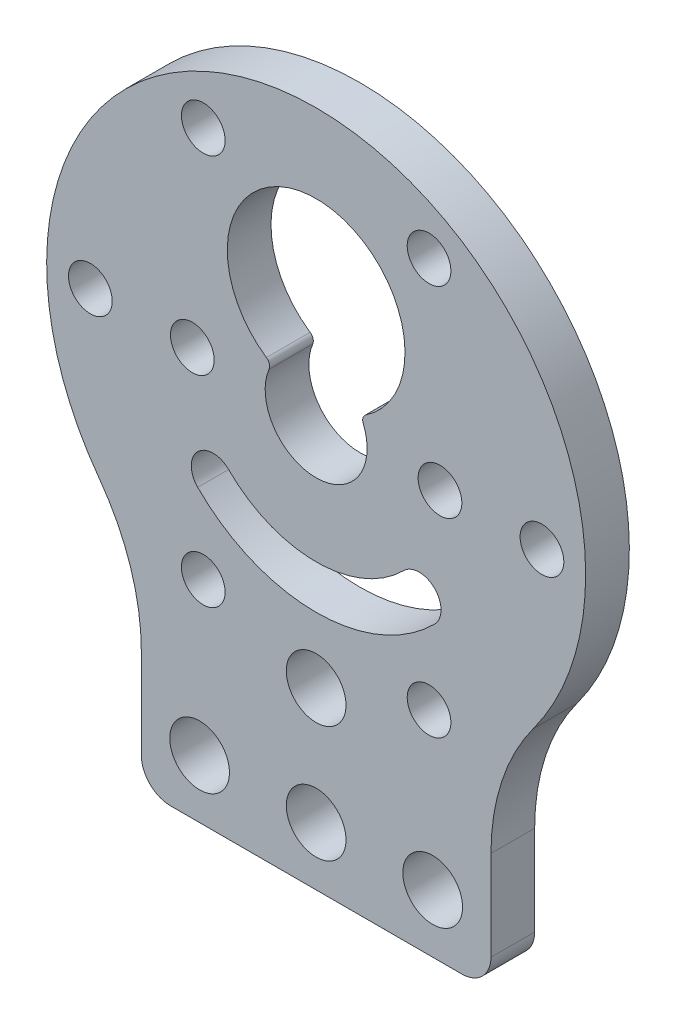
ISO-10303-21;
HEADER;
FILE_DESCRIPTION(('STEP AP214'),'2;1');
FILE_NAME('part.step','',(''),(''),'','','');
FILE_SCHEMA(('AUTOMOTIVE_DESIGN { 1 0 10303 214 1 1 1 1 }'));
ENDSEC;
DATA;
#1=APPLICATION_CONTEXT('core data for automotive mechanical design processes');
#2=APPLICATION_PROTOCOL_DEFINITION('international standard','automotive_design',2000,#1);
#3=PRODUCT_CONTEXT('',#1,'mechanical');
#4=PRODUCT('Part','Part','',(#3));
#5=PRODUCT_RELATED_PRODUCT_CATEGORY('part','',(#4));
#6=PRODUCT_DEFINITION_FORMATION('','',#4);
#7=PRODUCT_DEFINITION_CONTEXT('part definition',#1,'design');
#8=PRODUCT_DEFINITION('design','',#6,#7);
#9=PRODUCT_DEFINITION_SHAPE('','',#8);
#10=(LENGTH_UNIT() NAMED_UNIT(*) SI_UNIT(.MILLI.,.METRE.));
#11=(NAMED_UNIT(*) PLANE_ANGLE_UNIT() SI_UNIT($,.RADIAN.));
#12=(NAMED_UNIT(*) SI_UNIT($,.STERADIAN.) SOLID_ANGLE_UNIT());
#13=UNCERTAINTY_MEASURE_WITH_UNIT(LENGTH_MEASURE(1.E-05),#10,'distance_accuracy_value','');
#14=(GEOMETRIC_REPRESENTATION_CONTEXT(3) GLOBAL_UNCERTAINTY_ASSIGNED_CONTEXT((#13)) GLOBAL_UNIT_ASSIGNED_CONTEXT((#10,
#11,#12)) REPRESENTATION_CONTEXT('',''));
#15=CARTESIAN_POINT('',(0.,0.,0.));
#16=DIRECTION('',(0.,0.,1.));
#17=DIRECTION('',(1.,0.,0.));
#18=AXIS2_PLACEMENT_3D('',#15,#16,#17);
#19=CARTESIAN_POINT('',(-27.,-26.830532015052,0.));
#20=DIRECTION('',(0.,0.,1.));
#21=DIRECTION('',(1.,0.,0.));
#22=AXIS2_PLACEMENT_3D('',#19,#20,#21);
#23=CYLINDRICAL_SURFACE('',#22,15.);
#24=CARTESIAN_POINT('',(-27.,-26.830532015052,3.));
#25=DIRECTION('',(0.,0.,-1.));
#26=DIRECTION('',(-1.,0.,0.));
#27=AXIS2_PLACEMENT_3D('',#24,#25,#26);
#28=CIRCLE('',#27,15.);
#29=CARTESIAN_POINT('',(-14.910447761194,-17.9511893217451,3.));
#30=VERTEX_POINT('',#29);
#31=CARTESIAN_POINT('',(-12.,-26.830532015052,3.));
#32=VERTEX_POINT('',#31);
#33=EDGE_CURVE('E283',#30,#32,#28,.T.);
#34=ORIENTED_EDGE('',*,*,#33,.F.);
#35=DIRECTION('',(0.,0.,1.));
#36=VECTOR('',#35,1.);
#37=CARTESIAN_POINT('',(-14.910447761194,-17.9511893217451,0.));
#38=LINE('',#37,#36);
#39=CARTESIAN_POINT('',(-14.910447761194,-17.9511893217451,0.));
#40=VERTEX_POINT('',#39);
#41=EDGE_CURVE('E11',#40,#30,#38,.T.);
#42=ORIENTED_EDGE('',*,*,#41,.F.);
#43=CARTESIAN_POINT('',(-27.,-26.830532015052,0.));
#44=DIRECTION('',(0.,0.,-1.));
#45=DIRECTION('',(-1.,0.,0.));
#46=AXIS2_PLACEMENT_3D('',#43,#44,#45);
#47=CIRCLE('',#46,15.);
#48=CARTESIAN_POINT('',(-12.,-26.830532015052,0.));
#49=VERTEX_POINT('',#48);
#50=EDGE_CURVE('E286',#40,#49,#47,.T.);
#51=ORIENTED_EDGE('',*,*,#50,.T.);
#52=DIRECTION('',(0.,0.,1.));
#53=VECTOR('',#52,1.);
#54=CARTESIAN_POINT('',(-12.,-26.830532015052,0.));
#55=LINE('',#54,#53);
#56=EDGE_CURVE('E35',#49,#32,#55,.T.);
#57=ORIENTED_EDGE('',*,*,#56,.T.);
#58=EDGE_LOOP('',(#34,#42,#51,#57));
#59=FACE_BOUND('',#58,.T.);
#60=ADVANCED_FACE('F32',(#59),#23,.F.);
#61=CARTESIAN_POINT('',(0.,-7.,0.));
#62=DIRECTION('',(0.,0.,1.));
#63=DIRECTION('',(1.,0.,0.));
#64=AXIS2_PLACEMENT_3D('',#61,#62,#63);
#65=CYLINDRICAL_SURFACE('',#64,18.5);
#66=CARTESIAN_POINT('',(0.,-7.,3.));
#67=DIRECTION('',(0.,0.,1.));
#68=DIRECTION('',(1.,0.,0.));
#69=AXIS2_PLACEMENT_3D('',#66,#67,#68);
#70=CIRCLE('',#69,18.5);
#71=CARTESIAN_POINT('',(14.910447761194,-17.9511893217451,3.));
#72=VERTEX_POINT('',#71);
#73=EDGE_CURVE('E290',#72,#30,#70,.T.);
#74=ORIENTED_EDGE('',*,*,#73,.F.);
#75=DIRECTION('',(0.,0.,1.));
#76=VECTOR('',#75,1.);
#77=CARTESIAN_POINT('',(14.910447761194,-17.9511893217451,0.));
#78=LINE('',#77,#76);
#79=CARTESIAN_POINT('',(14.910447761194,-17.9511893217451,0.));
#80=VERTEX_POINT('',#79);
#81=EDGE_CURVE('E40',#80,#72,#78,.T.);
#82=ORIENTED_EDGE('',*,*,#81,.F.);
#83=CARTESIAN_POINT('',(0.,-7.,0.));
#84=DIRECTION('',(0.,0.,1.));
#85=DIRECTION('',(1.,0.,0.));
#86=AXIS2_PLACEMENT_3D('',#83,#84,#85);
#87=CIRCLE('',#86,18.5);
#88=EDGE_CURVE('E308',#80,#40,#87,.T.);
#89=ORIENTED_EDGE('',*,*,#88,.T.);
#90=ORIENTED_EDGE('',*,*,#41,.T.);
#91=EDGE_LOOP('',(#74,#82,#89,#90));
#92=FACE_BOUND('',#91,.T.);
#93=ADVANCED_FACE('F355',(#92),#65,.T.);
#94=CARTESIAN_POINT('',(27.,-26.830532015052,0.));
#95=DIRECTION('',(0.,0.,1.));
#96=DIRECTION('',(1.,0.,0.));
#97=AXIS2_PLACEMENT_3D('',#94,#95,#96);
#98=CYLINDRICAL_SURFACE('',#97,15.);
#99=CARTESIAN_POINT('',(27.,-26.830532015052,3.));
#100=DIRECTION('',(0.,0.,-1.));
#101=DIRECTION('',(-1.,0.,0.));
#102=AXIS2_PLACEMENT_3D('',#99,#100,#101);
#103=CIRCLE('',#102,15.);
#104=CARTESIAN_POINT('',(12.,-26.830532015052,3.));
#105=VERTEX_POINT('',#104);
#106=EDGE_CURVE('E328',#105,#72,#103,.T.);
#107=ORIENTED_EDGE('',*,*,#106,.F.);
#108=DIRECTION('',(0.,0.,1.));
#109=VECTOR('',#108,1.);
#110=CARTESIAN_POINT('',(12.,-26.830532015052,0.));
#111=LINE('',#110,#109);
#112=CARTESIAN_POINT('',(12.,-26.830532015052,0.));
#113=VERTEX_POINT('',#112);
#114=EDGE_CURVE('E334',#113,#105,#111,.T.);
#115=ORIENTED_EDGE('',*,*,#114,.F.);
#116=CARTESIAN_POINT('',(27.,-26.830532015052,0.));
#117=DIRECTION('',(0.,0.,-1.));
#118=DIRECTION('',(-1.,0.,0.));
#119=AXIS2_PLACEMENT_3D('',#116,#117,#118);
#120=CIRCLE('',#119,15.);
#121=EDGE_CURVE('E305',#113,#80,#120,.T.);
#122=ORIENTED_EDGE('',*,*,#121,.T.);
#123=ORIENTED_EDGE('',*,*,#81,.T.);
#124=EDGE_LOOP('',(#107,#115,#122,#123));
#125=FACE_BOUND('',#124,.T.);
#126=ADVANCED_FACE('F375',(#125),#98,.F.);
#127=CARTESIAN_POINT('',(12.,-33.,0.));
#128=DIRECTION('',(1.,0.,0.));
#129=DIRECTION('',(0.,1.,0.));
#130=AXIS2_PLACEMENT_3D('',#127,#128,#129);
#131=PLANE('',#130);
#132=DIRECTION('',(0.,1.,0.));
#133=VECTOR('',#132,1.);
#134=CARTESIAN_POINT('',(12.,-33.,3.));
#135=LINE('',#134,#133);
#136=CARTESIAN_POINT('',(12.,-33.,3.));
#137=VERTEX_POINT('',#136);
#138=EDGE_CURVE('E325',#137,#105,#135,.T.);
#139=ORIENTED_EDGE('',*,*,#138,.F.);
#140=DIRECTION('',(0.,0.,1.));
#141=VECTOR('',#140,1.);
#142=CARTESIAN_POINT('',(12.,-33.,0.));
#143=LINE('',#142,#141);
#144=CARTESIAN_POINT('',(12.,-33.,0.));
#145=VERTEX_POINT('',#144);
#146=EDGE_CURVE('E336',#145,#137,#143,.T.);
#147=ORIENTED_EDGE('',*,*,#146,.F.);
#148=DIRECTION('',(0.,1.,0.));
#149=VECTOR('',#148,1.);
#150=CARTESIAN_POINT('',(12.,-33.,0.));
#151=LINE('',#150,#149);
#152=EDGE_CURVE('E302',#145,#113,#151,.T.);
#153=ORIENTED_EDGE('',*,*,#152,.T.);
#154=ORIENTED_EDGE('',*,*,#114,.T.);
#155=EDGE_LOOP('',(#139,#147,#153,#154));
#156=FACE_BOUND('',#155,.T.);
#157=ADVANCED_FACE('F373',(#156),#131,.T.);
#158=CARTESIAN_POINT('',(10.,-33.,0.));
#159=DIRECTION('',(0.,0.,1.));
#160=DIRECTION('',(1.,0.,0.));
#161=AXIS2_PLACEMENT_3D('',#158,#159,#160);
#162=CYLINDRICAL_SURFACE('',#161,2.00000000000001);
#163=CARTESIAN_POINT('',(10.,-33.,3.));
#164=DIRECTION('',(0.,0.,1.));
#165=DIRECTION('',(1.,0.,0.));
#166=AXIS2_PLACEMENT_3D('',#163,#164,#165);
#167=CIRCLE('',#166,2.00000000000001);
#168=CARTESIAN_POINT('',(10.,-35.,3.));
#169=VERTEX_POINT('',#168);
#170=EDGE_CURVE('E322',#169,#137,#167,.T.);
#171=ORIENTED_EDGE('',*,*,#170,.F.);
#172=DIRECTION('',(0.,0.,1.));
#173=VECTOR('',#172,1.);
#174=CARTESIAN_POINT('',(10.,-35.,0.));
#175=LINE('',#174,#173);
#176=CARTESIAN_POINT('',(10.,-35.,0.));
#177=VERTEX_POINT('',#176);
#178=EDGE_CURVE('E338',#177,#169,#175,.T.);
#179=ORIENTED_EDGE('',*,*,#178,.F.);
#180=CARTESIAN_POINT('',(10.,-33.,0.));
#181=DIRECTION('',(0.,0.,1.));
#182=DIRECTION('',(1.,0.,0.));
#183=AXIS2_PLACEMENT_3D('',#180,#181,#182);
#184=CIRCLE('',#183,2.00000000000001);
#185=EDGE_CURVE('E299',#177,#145,#184,.T.);
#186=ORIENTED_EDGE('',*,*,#185,.T.);
#187=ORIENTED_EDGE('',*,*,#146,.T.);
#188=EDGE_LOOP('',(#171,#179,#186,#187));
#189=FACE_BOUND('',#188,.T.);
#190=ADVANCED_FACE('F369',(#189),#162,.T.);
#191=CARTESIAN_POINT('',(-10.,-35.,0.));
#192=DIRECTION('',(0.,-1.,0.));
#193=DIRECTION('',(0.,0.,-1.));
#194=AXIS2_PLACEMENT_3D('',#191,#192,#193);
#195=PLANE('',#194);
#196=DIRECTION('',(1.,0.,0.));
#197=VECTOR('',#196,1.);
#198=CARTESIAN_POINT('',(-10.,-35.,3.));
#199=LINE('',#198,#197);
#200=CARTESIAN_POINT('',(-10.,-35.,3.));
#201=VERTEX_POINT('',#200);
#202=EDGE_CURVE('E319',#201,#169,#199,.T.);
#203=ORIENTED_EDGE('',*,*,#202,.F.);
#204=DIRECTION('',(0.,0.,1.));
#205=VECTOR('',#204,1.);
#206=CARTESIAN_POINT('',(-10.,-35.,0.));
#207=LINE('',#206,#205);
#208=CARTESIAN_POINT('',(-10.,-35.,0.));
#209=VERTEX_POINT('',#208);
#210=EDGE_CURVE('E340',#209,#201,#207,.T.);
#211=ORIENTED_EDGE('',*,*,#210,.F.);
#212=DIRECTION('',(1.,0.,0.));
#213=VECTOR('',#212,1.);
#214=CARTESIAN_POINT('',(-10.,-35.,0.));
#215=LINE('',#214,#213);
#216=EDGE_CURVE('E296',#209,#177,#215,.T.);
#217=ORIENTED_EDGE('',*,*,#216,.T.);
#218=ORIENTED_EDGE('',*,*,#178,.T.);
#219=EDGE_LOOP('',(#203,#211,#217,#218));
#220=FACE_BOUND('',#219,.T.);
#221=ADVANCED_FACE('F367',(#220),#195,.T.);
#222=CARTESIAN_POINT('',(-10.,-33.,0.));
#223=DIRECTION('',(0.,0.,1.));
#224=DIRECTION('',(1.,0.,0.));
#225=AXIS2_PLACEMENT_3D('',#222,#223,#224);
#226=CYLINDRICAL_SURFACE('',#225,2.);
#227=CARTESIAN_POINT('',(-10.,-33.,3.));
#228=DIRECTION('',(0.,0.,1.));
#229=DIRECTION('',(1.,0.,0.));
#230=AXIS2_PLACEMENT_3D('',#227,#228,#229);
#231=CIRCLE('',#230,2.);
#232=CARTESIAN_POINT('',(-12.,-33.,3.));
#233=VERTEX_POINT('',#232);
#234=EDGE_CURVE('E316',#233,#201,#231,.T.);
#235=ORIENTED_EDGE('',*,*,#234,.F.);
#236=DIRECTION('',(0.,0.,1.));
#237=VECTOR('',#236,1.);
#238=CARTESIAN_POINT('',(-12.,-33.,0.));
#239=LINE('',#238,#237);
#240=CARTESIAN_POINT('',(-12.,-33.,0.));
#241=VERTEX_POINT('',#240);
#242=EDGE_CURVE('E341',#241,#233,#239,.T.);
#243=ORIENTED_EDGE('',*,*,#242,.F.);
#244=CARTESIAN_POINT('',(-10.,-33.,0.));
#245=DIRECTION('',(0.,0.,1.));
#246=DIRECTION('',(1.,0.,0.));
#247=AXIS2_PLACEMENT_3D('',#244,#245,#246);
#248=CIRCLE('',#247,2.);
#249=EDGE_CURVE('E293',#241,#209,#248,.T.);
#250=ORIENTED_EDGE('',*,*,#249,.T.);
#251=ORIENTED_EDGE('',*,*,#210,.T.);
#252=EDGE_LOOP('',(#235,#243,#250,#251));
#253=FACE_BOUND('',#252,.T.);
#254=ADVANCED_FACE('F363',(#253),#226,.T.);
#255=CARTESIAN_POINT('',(-12.,-26.830532015052,0.));
#256=DIRECTION('',(-1.,0.,0.));
#257=DIRECTION('',(0.,0.,1.));
#258=AXIS2_PLACEMENT_3D('',#255,#256,#257);
#259=PLANE('',#258);
#260=DIRECTION('',(0.,-1.,0.));
#261=VECTOR('',#260,1.);
#262=CARTESIAN_POINT('',(-12.,-26.830532015052,3.));
#263=LINE('',#262,#261);
#264=EDGE_CURVE('E313',#32,#233,#263,.T.);
#265=ORIENTED_EDGE('',*,*,#264,.F.);
#266=ORIENTED_EDGE('',*,*,#56,.F.);
#267=DIRECTION('',(0.,-1.,0.));
#268=VECTOR('',#267,1.);
#269=CARTESIAN_POINT('',(-12.,-26.830532015052,0.));
#270=LINE('',#269,#268);
#271=EDGE_CURVE('E289',#49,#241,#270,.T.);
#272=ORIENTED_EDGE('',*,*,#271,.T.);
#273=ORIENTED_EDGE('',*,*,#242,.T.);
#274=EDGE_LOOP('',(#265,#266,#272,#273));
#275=FACE_BOUND('',#274,.T.);
#276=ADVANCED_FACE('F349',(#275),#259,.T.);
#277=CARTESIAN_POINT('',(-27.,-26.830532015052,0.));
#278=DIRECTION('',(0.,0.,-1.));
#279=DIRECTION('',(-1.,0.,0.));
#280=AXIS2_PLACEMENT_3D('',#277,#278,#279);
#281=PLANE('',#280);
#282=CARTESIAN_POINT('',(0.,-7.,0.));
#283=DIRECTION('',(0.,0.,-1.));
#284=DIRECTION('',(1.,0.,0.));
#285=AXIS2_PLACEMENT_3D('',#282,#283,#284);
#286=CIRCLE('',#285,8.50000000000001);
#287=CARTESIAN_POINT('',(6.01040764008569,-13.0104076400857,0.));
#288=VERTEX_POINT('',#287);
#289=CARTESIAN_POINT('',(-6.01040764008568,-13.0104076400857,0.));
#290=VERTEX_POINT('',#289);
#291=EDGE_CURVE('E147',#288,#290,#286,.T.);
#292=ORIENTED_EDGE('',*,*,#291,.T.);
#293=CARTESIAN_POINT('',(-7.07106781186549,-14.0710678118655,0.));
#294=DIRECTION('',(0.,0.,1.));
#295=DIRECTION('',(-1.,0.,0.));
#296=AXIS2_PLACEMENT_3D('',#293,#294,#295);
#297=CIRCLE('',#296,1.50000000000001);
#298=CARTESIAN_POINT('',(-8.13172798364532,-15.1317279836453,0.));
#299=VERTEX_POINT('',#298);
#300=EDGE_CURVE('E156',#290,#299,#297,.T.);
#301=ORIENTED_EDGE('',*,*,#300,.T.);
#302=CARTESIAN_POINT('',(0.,-7.,0.));
#303=DIRECTION('',(0.,0.,1.));
#304=DIRECTION('',(-1.,0.,0.));
#305=AXIS2_PLACEMENT_3D('',#302,#303,#304);
#306=CIRCLE('',#305,11.5);
#307=CARTESIAN_POINT('',(8.13172798364532,-15.1317279836453,0.));
#308=VERTEX_POINT('',#307);
#309=EDGE_CURVE('E48',#299,#308,#306,.T.);
#310=ORIENTED_EDGE('',*,*,#309,.T.);
#311=CARTESIAN_POINT('',(7.07106781186549,-14.0710678118655,0.));
#312=DIRECTION('',(0.,0.,1.));
#313=DIRECTION('',(-1.,0.,0.));
#314=AXIS2_PLACEMENT_3D('',#311,#312,#313);
#315=CIRCLE('',#314,1.5);
#316=EDGE_CURVE('E153',#308,#288,#315,.T.);
#317=ORIENTED_EDGE('',*,*,#316,.T.);
#318=EDGE_LOOP('',(#292,#301,#310,#317));
#319=FACE_BOUND('',#318,.T.);
#320=CARTESIAN_POINT('',(8.5,-7.,0.));
#321=DIRECTION('',(0.,0.,1.));
#322=DIRECTION('',(-1.,0.,0.));
#323=AXIS2_PLACEMENT_3D('',#320,#321,#322);
#324=CIRCLE('',#323,1.5);
#325=CARTESIAN_POINT('',(7.,-7.,0.));
#326=VERTEX_POINT('',#325);
#327=EDGE_CURVE('E182',#326,#326,#324,.T.);
#328=ORIENTED_EDGE('',*,*,#327,.T.);
#329=EDGE_LOOP('',(#328));
#330=FACE_BOUND('',#329,.T.);
#331=CARTESIAN_POINT('',(0.,-23.,0.));
#332=DIRECTION('',(0.,0.,1.));
#333=DIRECTION('',(-1.,0.,0.));
#334=AXIS2_PLACEMENT_3D('',#331,#332,#333);
#335=CIRCLE('',#334,2.05);
#336=CARTESIAN_POINT('',(-2.05,-23.,0.));
#337=VERTEX_POINT('',#336);
#338=EDGE_CURVE('E188',#337,#337,#335,.T.);
#339=ORIENTED_EDGE('',*,*,#338,.T.);
#340=EDGE_LOOP('',(#339));
#341=FACE_BOUND('',#340,.T.);
#342=CARTESIAN_POINT('',(-8.5,-7.,0.));
#343=DIRECTION('',(0.,0.,1.));
#344=DIRECTION('',(-1.,0.,0.));
#345=AXIS2_PLACEMENT_3D('',#342,#343,#344);
#346=CIRCLE('',#345,1.5);
#347=CARTESIAN_POINT('',(-10.,-7.,0.));
#348=VERTEX_POINT('',#347);
#349=EDGE_CURVE('E194',#348,#348,#346,.T.);
#350=ORIENTED_EDGE('',*,*,#349,.T.);
#351=EDGE_LOOP('',(#350));
#352=FACE_BOUND('',#351,.T.);
#353=CARTESIAN_POINT('',(3.69523024054148,-5.46857142857143,0.));
#354=DIRECTION('',(0.,0.,-1.));
#355=DIRECTION('',(1.,0.,0.));
#356=AXIS2_PLACEMENT_3D('',#353,#354,#355);
#357=CIRCLE('',#356,0.5);
#358=CARTESIAN_POINT('',(3.2333264604738,-5.66,0.));
#359=VERTEX_POINT('',#358);
#360=CARTESIAN_POINT('',(3.41528855565198,-5.05428571428571,0.));
#361=VERTEX_POINT('',#360);
#362=EDGE_CURVE('E200',#359,#361,#357,.T.);
#363=ORIENTED_EDGE('',*,*,#362,.T.);
#364=CARTESIAN_POINT('',(0.,0.,0.));
#365=DIRECTION('',(0.,0.,1.));
#366=DIRECTION('',(-1.,0.,0.));
#367=AXIS2_PLACEMENT_3D('',#364,#365,#366);
#368=CIRCLE('',#367,6.1);
#369=CARTESIAN_POINT('',(-3.41528855565198,-5.05428571428571,0.));
#370=VERTEX_POINT('',#369);
#371=EDGE_CURVE('E203',#361,#370,#368,.T.);
#372=ORIENTED_EDGE('',*,*,#371,.T.);
#373=CARTESIAN_POINT('',(-3.69523024054148,-5.46857142857143,0.));
#374=DIRECTION('',(0.,0.,-1.));
#375=DIRECTION('',(1.,0.,0.));
#376=AXIS2_PLACEMENT_3D('',#373,#374,#375);
#377=CIRCLE('',#376,0.500000000000001);
#378=CARTESIAN_POINT('',(-3.2333264604738,-5.66,0.));
#379=VERTEX_POINT('',#378);
#380=EDGE_CURVE('E207',#370,#379,#377,.T.);
#381=ORIENTED_EDGE('',*,*,#380,.T.);
#382=CARTESIAN_POINT('',(0.,-7.,0.));
#383=DIRECTION('',(0.,0.,1.));
#384=DIRECTION('',(-1.,0.,0.));
#385=AXIS2_PLACEMENT_3D('',#382,#383,#384);
#386=CIRCLE('',#385,3.5);
#387=EDGE_CURVE('E210',#379,#359,#386,.T.);
#388=ORIENTED_EDGE('',*,*,#387,.T.);
#389=EDGE_LOOP('',(#363,#372,#381,#388));
#390=FACE_BOUND('',#389,.T.);
#391=CARTESIAN_POINT('',(-15.5,-6.99999999999988,0.));
#392=DIRECTION('',(0.,0.,1.));
#393=DIRECTION('',(-1.,0.,0.));
#394=AXIS2_PLACEMENT_3D('',#391,#392,#393);
#395=CIRCLE('',#394,1.5);
#396=CARTESIAN_POINT('',(-17.,-6.99999999999988,0.));
#397=VERTEX_POINT('',#396);
#398=EDGE_CURVE('E232',#397,#397,#395,.T.);
#399=ORIENTED_EDGE('',*,*,#398,.T.);
#400=EDGE_LOOP('',(#399));
#401=FACE_BOUND('',#400,.T.);
#402=CARTESIAN_POINT('',(-7.75000000000011,-20.4233937586588,0.));
#403=DIRECTION('',(0.,0.,1.));
#404=DIRECTION('',(-1.,0.,0.));
#405=AXIS2_PLACEMENT_3D('',#402,#403,#404);
#406=CIRCLE('',#405,1.5);
#407=CARTESIAN_POINT('',(-9.25000000000011,-20.4233937586588,0.));
#408=VERTEX_POINT('',#407);
#409=EDGE_CURVE('E238',#408,#408,#406,.T.);
#410=ORIENTED_EDGE('',*,*,#409,.T.);
#411=EDGE_LOOP('',(#410));
#412=FACE_BOUND('',#411,.T.);
#413=CARTESIAN_POINT('',(7.75,-20.4233937586588,0.));
#414=DIRECTION('',(0.,0.,1.));
#415=DIRECTION('',(-1.,0.,0.));
#416=AXIS2_PLACEMENT_3D('',#413,#414,#415);
#417=CIRCLE('',#416,1.5);
#418=CARTESIAN_POINT('',(6.25,-20.4233937586588,0.));
#419=VERTEX_POINT('',#418);
#420=EDGE_CURVE('E244',#419,#419,#417,.T.);
#421=ORIENTED_EDGE('',*,*,#420,.T.);
#422=EDGE_LOOP('',(#421));
#423=FACE_BOUND('',#422,.T.);
#424=CARTESIAN_POINT('',(15.5,-7.00000000000004,0.));
#425=DIRECTION('',(0.,0.,1.));
#426=DIRECTION('',(-1.,0.,0.));
#427=AXIS2_PLACEMENT_3D('',#424,#425,#426);
#428=CIRCLE('',#427,1.5);
#429=CARTESIAN_POINT('',(14.,-7.00000000000004,0.));
#430=VERTEX_POINT('',#429);
#431=EDGE_CURVE('E250',#430,#430,#428,.T.);
#432=ORIENTED_EDGE('',*,*,#431,.T.);
#433=EDGE_LOOP('',(#432));
#434=FACE_BOUND('',#433,.T.);
#435=CARTESIAN_POINT('',(7.75,6.42339375865879,0.));
#436=DIRECTION('',(0.,0.,1.));
#437=DIRECTION('',(-1.,0.,0.));
#438=AXIS2_PLACEMENT_3D('',#435,#436,#437);
#439=CIRCLE('',#438,1.5);
#440=CARTESIAN_POINT('',(6.25,6.42339375865879,0.));
#441=VERTEX_POINT('',#440);
#442=EDGE_CURVE('E256',#441,#441,#439,.T.);
#443=ORIENTED_EDGE('',*,*,#442,.T.);
#444=EDGE_LOOP('',(#443));
#445=FACE_BOUND('',#444,.T.);
#446=CARTESIAN_POINT('',(-7.75,6.42339375865879,0.));
#447=DIRECTION('',(0.,0.,1.));
#448=DIRECTION('',(-1.,0.,0.));
#449=AXIS2_PLACEMENT_3D('',#446,#447,#448);
#450=CIRCLE('',#449,1.5);
#451=CARTESIAN_POINT('',(-9.25,6.42339375865879,0.));
#452=VERTEX_POINT('',#451);
#453=EDGE_CURVE('E262',#452,#452,#450,.T.);
#454=ORIENTED_EDGE('',*,*,#453,.T.);
#455=EDGE_LOOP('',(#454));
#456=FACE_BOUND('',#455,.T.);
#457=CARTESIAN_POINT('',(0.,-31.,0.));
#458=DIRECTION('',(0.,0.,1.));
#459=DIRECTION('',(-1.,0.,0.));
#460=AXIS2_PLACEMENT_3D('',#457,#458,#459);
#461=CIRCLE('',#460,2.05);
#462=CARTESIAN_POINT('',(-2.05,-31.,0.));
#463=VERTEX_POINT('',#462);
#464=EDGE_CURVE('E268',#463,#463,#461,.T.);
#465=ORIENTED_EDGE('',*,*,#464,.T.);
#466=EDGE_LOOP('',(#465));
#467=FACE_BOUND('',#466,.T.);
#468=CARTESIAN_POINT('',(-8.,-31.,0.));
#469=DIRECTION('',(0.,0.,1.));
#470=DIRECTION('',(-1.,0.,0.));
#471=AXIS2_PLACEMENT_3D('',#468,#469,#470);
#472=CIRCLE('',#471,2.05);
#473=CARTESIAN_POINT('',(-10.05,-31.,0.));
#474=VERTEX_POINT('',#473);
#475=EDGE_CURVE('E274',#474,#474,#472,.T.);
#476=ORIENTED_EDGE('',*,*,#475,.T.);
#477=EDGE_LOOP('',(#476));
#478=FACE_BOUND('',#477,.T.);
#479=CARTESIAN_POINT('',(8.,-31.,0.));
#480=DIRECTION('',(0.,0.,1.));
#481=DIRECTION('',(-1.,0.,0.));
#482=AXIS2_PLACEMENT_3D('',#479,#480,#481);
#483=CIRCLE('',#482,2.05);
#484=CARTESIAN_POINT('',(5.95,-31.,0.));
#485=VERTEX_POINT('',#484);
#486=EDGE_CURVE('E280',#485,#485,#483,.T.);
#487=ORIENTED_EDGE('',*,*,#486,.T.);
#488=EDGE_LOOP('',(#487));
#489=FACE_BOUND('',#488,.T.);
#490=ORIENTED_EDGE('',*,*,#50,.F.);
#491=ORIENTED_EDGE('',*,*,#88,.F.);
#492=ORIENTED_EDGE('',*,*,#121,.F.);
#493=ORIENTED_EDGE('',*,*,#152,.F.);
#494=ORIENTED_EDGE('',*,*,#185,.F.);
#495=ORIENTED_EDGE('',*,*,#216,.F.);
#496=ORIENTED_EDGE('',*,*,#249,.F.);
#497=ORIENTED_EDGE('',*,*,#271,.F.);
#498=EDGE_LOOP('',(#490,#491,#492,#493,#494,#495,#496,#497));
#499=FACE_BOUND('',#498,.T.);
#500=ADVANCED_FACE('F160',(#319,#330,#341,#352,#390,#401,#412,#423,#434,#445,#456,#467,#478,
#489,#499),#281,.T.);
#501=CARTESIAN_POINT('',(-27.,-26.830532015052,3.));
#502=DIRECTION('',(0.,0.,-1.));
#503=DIRECTION('',(-1.,0.,0.));
#504=AXIS2_PLACEMENT_3D('',#501,#502,#503);
#505=PLANE('',#504);
#506=CARTESIAN_POINT('',(-7.07106781186549,-14.0710678118655,3.));
#507=DIRECTION('',(0.,0.,1.));
#508=DIRECTION('',(-1.,0.,0.));
#509=AXIS2_PLACEMENT_3D('',#506,#507,#508);
#510=CIRCLE('',#509,1.50000000000001);
#511=CARTESIAN_POINT('',(-6.01040764008568,-13.0104076400857,3.));
#512=VERTEX_POINT('',#511);
#513=CARTESIAN_POINT('',(-8.1317279836453,-15.1317279836453,3.));
#514=VERTEX_POINT('',#513);
#515=EDGE_CURVE('E172',#512,#514,#510,.T.);
#516=ORIENTED_EDGE('',*,*,#515,.F.);
#517=CARTESIAN_POINT('',(0.,-7.,3.));
#518=DIRECTION('',(0.,0.,-1.));
#519=DIRECTION('',(1.,0.,0.));
#520=AXIS2_PLACEMENT_3D('',#517,#518,#519);
#521=CIRCLE('',#520,8.50000000000001);
#522=CARTESIAN_POINT('',(6.01040764008569,-13.0104076400857,3.));
#523=VERTEX_POINT('',#522);
#524=EDGE_CURVE('E56',#523,#512,#521,.T.);
#525=ORIENTED_EDGE('',*,*,#524,.F.);
#526=CARTESIAN_POINT('',(7.07106781186549,-14.0710678118655,3.));
#527=DIRECTION('',(0.,0.,1.));
#528=DIRECTION('',(-1.,0.,0.));
#529=AXIS2_PLACEMENT_3D('',#526,#527,#528);
#530=CIRCLE('',#529,1.5);
#531=CARTESIAN_POINT('',(8.13172798364532,-15.1317279836453,3.));
#532=VERTEX_POINT('',#531);
#533=EDGE_CURVE('E163',#532,#523,#530,.T.);
#534=ORIENTED_EDGE('',*,*,#533,.F.);
#535=CARTESIAN_POINT('',(0.,-7.,3.));
#536=DIRECTION('',(0.,0.,1.));
#537=DIRECTION('',(-1.,0.,0.));
#538=AXIS2_PLACEMENT_3D('',#535,#536,#537);
#539=CIRCLE('',#538,11.5);
#540=EDGE_CURVE('E166',#514,#532,#539,.T.);
#541=ORIENTED_EDGE('',*,*,#540,.F.);
#542=EDGE_LOOP('',(#516,#525,#534,#541));
#543=FACE_BOUND('',#542,.T.);
#544=CARTESIAN_POINT('',(8.5,-7.,3.));
#545=DIRECTION('',(0.,0.,1.));
#546=DIRECTION('',(-1.,0.,0.));
#547=AXIS2_PLACEMENT_3D('',#544,#545,#546);
#548=CIRCLE('',#547,1.5);
#549=CARTESIAN_POINT('',(7.,-7.,3.));
#550=VERTEX_POINT('',#549);
#551=EDGE_CURVE('E178',#550,#550,#548,.T.);
#552=ORIENTED_EDGE('',*,*,#551,.F.);
#553=EDGE_LOOP('',(#552));
#554=FACE_BOUND('',#553,.T.);
#555=CARTESIAN_POINT('',(0.,-23.,3.));
#556=DIRECTION('',(0.,0.,1.));
#557=DIRECTION('',(-1.,0.,0.));
#558=AXIS2_PLACEMENT_3D('',#555,#556,#557);
#559=CIRCLE('',#558,2.05);
#560=CARTESIAN_POINT('',(-2.05,-23.,3.));
#561=VERTEX_POINT('',#560);
#562=EDGE_CURVE('E185',#561,#561,#559,.T.);
#563=ORIENTED_EDGE('',*,*,#562,.F.);
#564=EDGE_LOOP('',(#563));
#565=FACE_BOUND('',#564,.T.);
#566=CARTESIAN_POINT('',(-8.5,-7.,3.));
#567=DIRECTION('',(0.,0.,1.));
#568=DIRECTION('',(-1.,0.,0.));
#569=AXIS2_PLACEMENT_3D('',#566,#567,#568);
#570=CIRCLE('',#569,1.5);
#571=CARTESIAN_POINT('',(-10.,-7.,3.));
#572=VERTEX_POINT('',#571);
#573=EDGE_CURVE('E191',#572,#572,#570,.T.);
#574=ORIENTED_EDGE('',*,*,#573,.F.);
#575=EDGE_LOOP('',(#574));
#576=FACE_BOUND('',#575,.T.);
#577=CARTESIAN_POINT('',(0.,0.,3.));
#578=DIRECTION('',(0.,0.,1.));
#579=DIRECTION('',(-1.,0.,0.));
#580=AXIS2_PLACEMENT_3D('',#577,#578,#579);
#581=CIRCLE('',#580,6.1);
#582=CARTESIAN_POINT('',(3.41528855565198,-5.05428571428571,3.));
#583=VERTEX_POINT('',#582);
#584=CARTESIAN_POINT('',(-3.41528855565198,-5.05428571428571,3.));
#585=VERTEX_POINT('',#584);
#586=EDGE_CURVE('E215',#583,#585,#581,.T.);
#587=ORIENTED_EDGE('',*,*,#586,.F.);
#588=CARTESIAN_POINT('',(3.69523024054148,-5.46857142857143,3.));
#589=DIRECTION('',(0.,0.,-1.));
#590=DIRECTION('',(1.,0.,0.));
#591=AXIS2_PLACEMENT_3D('',#588,#589,#590);
#592=CIRCLE('',#591,0.5);
#593=CARTESIAN_POINT('',(3.2333264604738,-5.66,3.));
#594=VERTEX_POINT('',#593);
#595=EDGE_CURVE('E197',#594,#583,#592,.T.);
#596=ORIENTED_EDGE('',*,*,#595,.F.);
#597=CARTESIAN_POINT('',(0.,-7.,3.));
#598=DIRECTION('',(0.,0.,1.));
#599=DIRECTION('',(-1.,0.,0.));
#600=AXIS2_PLACEMENT_3D('',#597,#598,#599);
#601=CIRCLE('',#600,3.5);
#602=CARTESIAN_POINT('',(-3.2333264604738,-5.66,3.));
#603=VERTEX_POINT('',#602);
#604=EDGE_CURVE('E204',#603,#594,#601,.T.);
#605=ORIENTED_EDGE('',*,*,#604,.F.);
#606=CARTESIAN_POINT('',(-3.69523024054148,-5.46857142857143,3.));
#607=DIRECTION('',(0.,0.,-1.));
#608=DIRECTION('',(1.,0.,0.));
#609=AXIS2_PLACEMENT_3D('',#606,#607,#608);
#610=CIRCLE('',#609,0.500000000000001);
#611=EDGE_CURVE('E218',#585,#603,#610,.T.);
#612=ORIENTED_EDGE('',*,*,#611,.F.);
#613=EDGE_LOOP('',(#587,#596,#605,#612));
#614=FACE_BOUND('',#613,.T.);
#615=CARTESIAN_POINT('',(-15.5,-6.99999999999988,3.));
#616=DIRECTION('',(0.,0.,1.));
#617=DIRECTION('',(-1.,0.,0.));
#618=AXIS2_PLACEMENT_3D('',#615,#616,#617);
#619=CIRCLE('',#618,1.5);
#620=CARTESIAN_POINT('',(-17.,-6.99999999999988,3.));
#621=VERTEX_POINT('',#620);
#622=EDGE_CURVE('E225',#621,#621,#619,.T.);
#623=ORIENTED_EDGE('',*,*,#622,.F.);
#624=EDGE_LOOP('',(#623));
#625=FACE_BOUND('',#624,.T.);
#626=CARTESIAN_POINT('',(-7.75000000000011,-20.4233937586588,3.));
#627=DIRECTION('',(0.,0.,1.));
#628=DIRECTION('',(-1.,0.,0.));
#629=AXIS2_PLACEMENT_3D('',#626,#627,#628);
#630=CIRCLE('',#629,1.5);
#631=CARTESIAN_POINT('',(-9.25000000000011,-20.4233937586588,3.));
#632=VERTEX_POINT('',#631);
#633=EDGE_CURVE('E235',#632,#632,#630,.T.);
#634=ORIENTED_EDGE('',*,*,#633,.F.);
#635=EDGE_LOOP('',(#634));
#636=FACE_BOUND('',#635,.T.);
#637=CARTESIAN_POINT('',(7.75,-20.4233937586588,3.));
#638=DIRECTION('',(0.,0.,1.));
#639=DIRECTION('',(-1.,0.,0.));
#640=AXIS2_PLACEMENT_3D('',#637,#638,#639);
#641=CIRCLE('',#640,1.5);
#642=CARTESIAN_POINT('',(6.25,-20.4233937586588,3.));
#643=VERTEX_POINT('',#642);
#644=EDGE_CURVE('E241',#643,#643,#641,.T.);
#645=ORIENTED_EDGE('',*,*,#644,.F.);
#646=EDGE_LOOP('',(#645));
#647=FACE_BOUND('',#646,.T.);
#648=CARTESIAN_POINT('',(15.5,-7.00000000000004,3.));
#649=DIRECTION('',(0.,0.,1.));
#650=DIRECTION('',(-1.,0.,0.));
#651=AXIS2_PLACEMENT_3D('',#648,#649,#650);
#652=CIRCLE('',#651,1.5);
#653=CARTESIAN_POINT('',(14.,-7.00000000000004,3.));
#654=VERTEX_POINT('',#653);
#655=EDGE_CURVE('E247',#654,#654,#652,.T.);
#656=ORIENTED_EDGE('',*,*,#655,.F.);
#657=EDGE_LOOP('',(#656));
#658=FACE_BOUND('',#657,.T.);
#659=CARTESIAN_POINT('',(7.75,6.42339375865879,3.));
#660=DIRECTION('',(0.,0.,1.));
#661=DIRECTION('',(-1.,0.,0.));
#662=AXIS2_PLACEMENT_3D('',#659,#660,#661);
#663=CIRCLE('',#662,1.5);
#664=CARTESIAN_POINT('',(6.25,6.42339375865879,3.));
#665=VERTEX_POINT('',#664);
#666=EDGE_CURVE('E253',#665,#665,#663,.T.);
#667=ORIENTED_EDGE('',*,*,#666,.F.);
#668=EDGE_LOOP('',(#667));
#669=FACE_BOUND('',#668,.T.);
#670=CARTESIAN_POINT('',(-7.75,6.42339375865879,3.));
#671=DIRECTION('',(0.,0.,1.));
#672=DIRECTION('',(-1.,0.,0.));
#673=AXIS2_PLACEMENT_3D('',#670,#671,#672);
#674=CIRCLE('',#673,1.5);
#675=CARTESIAN_POINT('',(-9.25,6.42339375865879,3.));
#676=VERTEX_POINT('',#675);
#677=EDGE_CURVE('E259',#676,#676,#674,.T.);
#678=ORIENTED_EDGE('',*,*,#677,.F.);
#679=EDGE_LOOP('',(#678));
#680=FACE_BOUND('',#679,.T.);
#681=CARTESIAN_POINT('',(0.,-31.,3.));
#682=DIRECTION('',(0.,0.,1.));
#683=DIRECTION('',(-1.,0.,0.));
#684=AXIS2_PLACEMENT_3D('',#681,#682,#683);
#685=CIRCLE('',#684,2.05);
#686=CARTESIAN_POINT('',(-2.05,-31.,3.));
#687=VERTEX_POINT('',#686);
#688=EDGE_CURVE('E265',#687,#687,#685,.T.);
#689=ORIENTED_EDGE('',*,*,#688,.F.);
#690=EDGE_LOOP('',(#689));
#691=FACE_BOUND('',#690,.T.);
#692=CARTESIAN_POINT('',(-8.,-31.,3.));
#693=DIRECTION('',(0.,0.,1.));
#694=DIRECTION('',(-1.,0.,0.));
#695=AXIS2_PLACEMENT_3D('',#692,#693,#694);
#696=CIRCLE('',#695,2.05);
#697=CARTESIAN_POINT('',(-10.05,-31.,3.));
#698=VERTEX_POINT('',#697);
#699=EDGE_CURVE('E271',#698,#698,#696,.T.);
#700=ORIENTED_EDGE('',*,*,#699,.F.);
#701=EDGE_LOOP('',(#700));
#702=FACE_BOUND('',#701,.T.);
#703=CARTESIAN_POINT('',(8.,-31.,3.));
#704=DIRECTION('',(0.,0.,1.));
#705=DIRECTION('',(-1.,0.,0.));
#706=AXIS2_PLACEMENT_3D('',#703,#704,#705);
#707=CIRCLE('',#706,2.05);
#708=CARTESIAN_POINT('',(5.95,-31.,3.));
#709=VERTEX_POINT('',#708);
#710=EDGE_CURVE('E277',#709,#709,#707,.T.);
#711=ORIENTED_EDGE('',*,*,#710,.F.);
#712=EDGE_LOOP('',(#711));
#713=FACE_BOUND('',#712,.T.);
#714=ORIENTED_EDGE('',*,*,#33,.T.);
#715=ORIENTED_EDGE('',*,*,#264,.T.);
#716=ORIENTED_EDGE('',*,*,#234,.T.);
#717=ORIENTED_EDGE('',*,*,#202,.T.);
#718=ORIENTED_EDGE('',*,*,#170,.T.);
#719=ORIENTED_EDGE('',*,*,#138,.T.);
#720=ORIENTED_EDGE('',*,*,#106,.T.);
#721=ORIENTED_EDGE('',*,*,#73,.T.);
#722=EDGE_LOOP('',(#714,#715,#716,#717,#718,#719,#720,#721));
#723=FACE_BOUND('',#722,.T.);
#724=ADVANCED_FACE('F351',(#543,#554,#565,#576,#614,#625,#636,#647,#658,#669,#680,#691,#702,
#713,#723),#505,.F.);
#725=CARTESIAN_POINT('',(8.,-31.,0.));
#726=DIRECTION('',(0.,0.,1.));
#727=DIRECTION('',(1.,0.,0.));
#728=AXIS2_PLACEMENT_3D('',#725,#726,#727);
#729=CYLINDRICAL_SURFACE('',#728,2.05);
#730=ORIENTED_EDGE('',*,*,#486,.F.);
#731=EDGE_LOOP('',(#730));
#732=FACE_BOUND('',#731,.T.);
#733=ORIENTED_EDGE('',*,*,#710,.T.);
#734=EDGE_LOOP('',(#733));
#735=FACE_BOUND('',#734,.T.);
#736=ADVANCED_FACE('F449',(#732,#735),#729,.F.);
#737=CARTESIAN_POINT('',(-8.,-31.,0.));
#738=DIRECTION('',(0.,0.,1.));
#739=DIRECTION('',(1.,0.,0.));
#740=AXIS2_PLACEMENT_3D('',#737,#738,#739);
#741=CYLINDRICAL_SURFACE('',#740,2.05);
#742=ORIENTED_EDGE('',*,*,#475,.F.);
#743=EDGE_LOOP('',(#742));
#744=FACE_BOUND('',#743,.T.);
#745=ORIENTED_EDGE('',*,*,#699,.T.);
#746=EDGE_LOOP('',(#745));
#747=FACE_BOUND('',#746,.T.);
#748=ADVANCED_FACE('F459',(#744,#747),#741,.F.);
#749=CARTESIAN_POINT('',(0.,-31.,0.));
#750=DIRECTION('',(0.,0.,1.));
#751=DIRECTION('',(1.,0.,0.));
#752=AXIS2_PLACEMENT_3D('',#749,#750,#751);
#753=CYLINDRICAL_SURFACE('',#752,2.05);
#754=ORIENTED_EDGE('',*,*,#464,.F.);
#755=EDGE_LOOP('',(#754));
#756=FACE_BOUND('',#755,.T.);
#757=ORIENTED_EDGE('',*,*,#688,.T.);
#758=EDGE_LOOP('',(#757));
#759=FACE_BOUND('',#758,.T.);
#760=ADVANCED_FACE('F469',(#756,#759),#753,.F.);
#761=CARTESIAN_POINT('',(-7.75,6.42339375865879,0.));
#762=DIRECTION('',(0.,0.,1.));
#763=DIRECTION('',(1.,0.,0.));
#764=AXIS2_PLACEMENT_3D('',#761,#762,#763);
#765=CYLINDRICAL_SURFACE('',#764,1.5);
#766=ORIENTED_EDGE('',*,*,#453,.F.);
#767=EDGE_LOOP('',(#766));
#768=FACE_BOUND('',#767,.T.);
#769=ORIENTED_EDGE('',*,*,#677,.T.);
#770=EDGE_LOOP('',(#769));
#771=FACE_BOUND('',#770,.T.);
#772=ADVANCED_FACE('F479',(#768,#771),#765,.F.);
#773=CARTESIAN_POINT('',(7.75,6.42339375865879,0.));
#774=DIRECTION('',(0.,0.,1.));
#775=DIRECTION('',(1.,0.,0.));
#776=AXIS2_PLACEMENT_3D('',#773,#774,#775);
#777=CYLINDRICAL_SURFACE('',#776,1.5);
#778=ORIENTED_EDGE('',*,*,#442,.F.);
#779=EDGE_LOOP('',(#778));
#780=FACE_BOUND('',#779,.T.);
#781=ORIENTED_EDGE('',*,*,#666,.T.);
#782=EDGE_LOOP('',(#781));
#783=FACE_BOUND('',#782,.T.);
#784=ADVANCED_FACE('F489',(#780,#783),#777,.F.);
#785=CARTESIAN_POINT('',(15.5,-7.00000000000004,0.));
#786=DIRECTION('',(0.,0.,1.));
#787=DIRECTION('',(1.,0.,0.));
#788=AXIS2_PLACEMENT_3D('',#785,#786,#787);
#789=CYLINDRICAL_SURFACE('',#788,1.5);
#790=ORIENTED_EDGE('',*,*,#431,.F.);
#791=EDGE_LOOP('',(#790));
#792=FACE_BOUND('',#791,.T.);
#793=ORIENTED_EDGE('',*,*,#655,.T.);
#794=EDGE_LOOP('',(#793));
#795=FACE_BOUND('',#794,.T.);
#796=ADVANCED_FACE('F499',(#792,#795),#789,.F.);
#797=CARTESIAN_POINT('',(7.75,-20.4233937586588,0.));
#798=DIRECTION('',(0.,0.,1.));
#799=DIRECTION('',(1.,0.,0.));
#800=AXIS2_PLACEMENT_3D('',#797,#798,#799);
#801=CYLINDRICAL_SURFACE('',#800,1.5);
#802=ORIENTED_EDGE('',*,*,#420,.F.);
#803=EDGE_LOOP('',(#802));
#804=FACE_BOUND('',#803,.T.);
#805=ORIENTED_EDGE('',*,*,#644,.T.);
#806=EDGE_LOOP('',(#805));
#807=FACE_BOUND('',#806,.T.);
#808=ADVANCED_FACE('F509',(#804,#807),#801,.F.);
#809=CARTESIAN_POINT('',(-7.75000000000011,-20.4233937586588,0.));
#810=DIRECTION('',(0.,0.,1.));
#811=DIRECTION('',(1.,0.,0.));
#812=AXIS2_PLACEMENT_3D('',#809,#810,#811);
#813=CYLINDRICAL_SURFACE('',#812,1.5);
#814=ORIENTED_EDGE('',*,*,#409,.F.);
#815=EDGE_LOOP('',(#814));
#816=FACE_BOUND('',#815,.T.);
#817=ORIENTED_EDGE('',*,*,#633,.T.);
#818=EDGE_LOOP('',(#817));
#819=FACE_BOUND('',#818,.T.);
#820=ADVANCED_FACE('F519',(#816,#819),#813,.F.);
#821=CARTESIAN_POINT('',(-15.5,-6.99999999999988,0.));
#822=DIRECTION('',(0.,0.,1.));
#823=DIRECTION('',(1.,0.,0.));
#824=AXIS2_PLACEMENT_3D('',#821,#822,#823);
#825=CYLINDRICAL_SURFACE('',#824,1.5);
#826=ORIENTED_EDGE('',*,*,#398,.F.);
#827=EDGE_LOOP('',(#826));
#828=FACE_BOUND('',#827,.T.);
#829=ORIENTED_EDGE('',*,*,#622,.T.);
#830=EDGE_LOOP('',(#829));
#831=FACE_BOUND('',#830,.T.);
#832=ADVANCED_FACE('F529',(#828,#831),#825,.F.);
#833=CARTESIAN_POINT('',(3.69523024054148,-5.46857142857143,0.));
#834=DIRECTION('',(0.,0.,1.));
#835=DIRECTION('',(1.,0.,0.));
#836=AXIS2_PLACEMENT_3D('',#833,#834,#835);
#837=CYLINDRICAL_SURFACE('',#836,0.5);
#838=ORIENTED_EDGE('',*,*,#595,.T.);
#839=DIRECTION('',(0.,0.,1.));
#840=VECTOR('',#839,1.);
#841=CARTESIAN_POINT('',(3.41528855565198,-5.05428571428571,0.));
#842=LINE('',#841,#840);
#843=EDGE_CURVE('E213',#361,#583,#842,.T.);
#844=ORIENTED_EDGE('',*,*,#843,.F.);
#845=ORIENTED_EDGE('',*,*,#362,.F.);
#846=DIRECTION('',(0.,0.,1.));
#847=VECTOR('',#846,1.);
#848=CARTESIAN_POINT('',(3.2333264604738,-5.66,0.));
#849=LINE('',#848,#847);
#850=EDGE_CURVE('E223',#359,#594,#849,.T.);
#851=ORIENTED_EDGE('',*,*,#850,.T.);
#852=EDGE_LOOP('',(#838,#844,#845,#851));
#853=FACE_BOUND('',#852,.T.);
#854=ADVANCED_FACE('F539',(#853),#837,.T.);
#855=CARTESIAN_POINT('',(0.,-7.,0.));
#856=DIRECTION('',(0.,0.,1.));
#857=DIRECTION('',(1.,0.,0.));
#858=AXIS2_PLACEMENT_3D('',#855,#856,#857);
#859=CYLINDRICAL_SURFACE('',#858,3.5);
#860=ORIENTED_EDGE('',*,*,#604,.T.);
#861=ORIENTED_EDGE('',*,*,#850,.F.);
#862=ORIENTED_EDGE('',*,*,#387,.F.);
#863=DIRECTION('',(0.,0.,1.));
#864=VECTOR('',#863,1.);
#865=CARTESIAN_POINT('',(-3.2333264604738,-5.66,0.));
#866=LINE('',#865,#864);
#867=EDGE_CURVE('E226',#379,#603,#866,.T.);
#868=ORIENTED_EDGE('',*,*,#867,.T.);
#869=EDGE_LOOP('',(#860,#861,#862,#868));
#870=FACE_BOUND('',#869,.T.);
#871=ADVANCED_FACE('F549',(#870),#859,.F.);
#872=CARTESIAN_POINT('',(-3.69523024054148,-5.46857142857143,0.));
#873=DIRECTION('',(0.,0.,1.));
#874=DIRECTION('',(1.,0.,0.));
#875=AXIS2_PLACEMENT_3D('',#872,#873,#874);
#876=CYLINDRICAL_SURFACE('',#875,0.500000000000001);
#877=ORIENTED_EDGE('',*,*,#611,.T.);
#878=ORIENTED_EDGE('',*,*,#867,.F.);
#879=ORIENTED_EDGE('',*,*,#380,.F.);
#880=DIRECTION('',(0.,0.,1.));
#881=VECTOR('',#880,1.);
#882=CARTESIAN_POINT('',(-3.41528855565198,-5.05428571428571,0.));
#883=LINE('',#882,#881);
#884=EDGE_CURVE('E228',#370,#585,#883,.T.);
#885=ORIENTED_EDGE('',*,*,#884,.T.);
#886=EDGE_LOOP('',(#877,#878,#879,#885));
#887=FACE_BOUND('',#886,.T.);
#888=ADVANCED_FACE('F559',(#887),#876,.T.);
#889=CARTESIAN_POINT('',(0.,0.,0.));
#890=DIRECTION('',(0.,0.,1.));
#891=DIRECTION('',(1.,0.,0.));
#892=AXIS2_PLACEMENT_3D('',#889,#890,#891);
#893=CYLINDRICAL_SURFACE('',#892,6.1);
#894=ORIENTED_EDGE('',*,*,#586,.T.);
#895=ORIENTED_EDGE('',*,*,#884,.F.);
#896=ORIENTED_EDGE('',*,*,#371,.F.);
#897=ORIENTED_EDGE('',*,*,#843,.T.);
#898=EDGE_LOOP('',(#894,#895,#896,#897));
#899=FACE_BOUND('',#898,.T.);
#900=ADVANCED_FACE('F569',(#899),#893,.F.);
#901=CARTESIAN_POINT('',(-8.5,-7.,0.));
#902=DIRECTION('',(0.,0.,1.));
#903=DIRECTION('',(1.,0.,0.));
#904=AXIS2_PLACEMENT_3D('',#901,#902,#903);
#905=CYLINDRICAL_SURFACE('',#904,1.5);
#906=ORIENTED_EDGE('',*,*,#349,.F.);
#907=EDGE_LOOP('',(#906));
#908=FACE_BOUND('',#907,.T.);
#909=ORIENTED_EDGE('',*,*,#573,.T.);
#910=EDGE_LOOP('',(#909));
#911=FACE_BOUND('',#910,.T.);
#912=ADVANCED_FACE('F579',(#908,#911),#905,.F.);
#913=CARTESIAN_POINT('',(0.,-23.,0.));
#914=DIRECTION('',(0.,0.,1.));
#915=DIRECTION('',(1.,0.,0.));
#916=AXIS2_PLACEMENT_3D('',#913,#914,#915);
#917=CYLINDRICAL_SURFACE('',#916,2.05);
#918=ORIENTED_EDGE('',*,*,#338,.F.);
#919=EDGE_LOOP('',(#918));
#920=FACE_BOUND('',#919,.T.);
#921=ORIENTED_EDGE('',*,*,#562,.T.);
#922=EDGE_LOOP('',(#921));
#923=FACE_BOUND('',#922,.T.);
#924=ADVANCED_FACE('F589',(#920,#923),#917,.F.);
#925=CARTESIAN_POINT('',(8.5,-7.,0.));
#926=DIRECTION('',(0.,0.,1.));
#927=DIRECTION('',(1.,0.,0.));
#928=AXIS2_PLACEMENT_3D('',#925,#926,#927);
#929=CYLINDRICAL_SURFACE('',#928,1.5);
#930=ORIENTED_EDGE('',*,*,#327,.F.);
#931=EDGE_LOOP('',(#930));
#932=FACE_BOUND('',#931,.T.);
#933=ORIENTED_EDGE('',*,*,#551,.T.);
#934=EDGE_LOOP('',(#933));
#935=FACE_BOUND('',#934,.T.);
#936=ADVANCED_FACE('F599',(#932,#935),#929,.F.);
#937=CARTESIAN_POINT('',(0.,-7.,0.));
#938=DIRECTION('',(0.,0.,1.));
#939=DIRECTION('',(1.,0.,0.));
#940=AXIS2_PLACEMENT_3D('',#937,#938,#939);
#941=CYLINDRICAL_SURFACE('',#940,8.50000000000001);
#942=ORIENTED_EDGE('',*,*,#524,.T.);
#943=DIRECTION('',(0.,0.,1.));
#944=VECTOR('',#943,1.);
#945=CARTESIAN_POINT('',(-6.01040764008568,-13.0104076400857,0.));
#946=LINE('',#945,#944);
#947=EDGE_CURVE('E143',#290,#512,#946,.T.);
#948=ORIENTED_EDGE('',*,*,#947,.F.);
#949=ORIENTED_EDGE('',*,*,#291,.F.);
#950=DIRECTION('',(0.,0.,1.));
#951=VECTOR('',#950,1.);
#952=CARTESIAN_POINT('',(6.01040764008569,-13.0104076400857,0.));
#953=LINE('',#952,#951);
#954=EDGE_CURVE('E176',#288,#523,#953,.T.);
#955=ORIENTED_EDGE('',*,*,#954,.T.);
#956=EDGE_LOOP('',(#942,#948,#949,#955));
#957=FACE_BOUND('',#956,.T.);
#958=ADVANCED_FACE('F145',(#957),#941,.T.);
#959=CARTESIAN_POINT('',(7.07106781186549,-14.0710678118655,0.));
#960=DIRECTION('',(0.,0.,1.));
#961=DIRECTION('',(1.,0.,0.));
#962=AXIS2_PLACEMENT_3D('',#959,#960,#961);
#963=CYLINDRICAL_SURFACE('',#962,1.5);
#964=ORIENTED_EDGE('',*,*,#533,.T.);
#965=ORIENTED_EDGE('',*,*,#954,.F.);
#966=ORIENTED_EDGE('',*,*,#316,.F.);
#967=DIRECTION('',(0.,0.,1.));
#968=VECTOR('',#967,1.);
#969=CARTESIAN_POINT('',(8.13172798364532,-15.1317279836453,0.));
#970=LINE('',#969,#968);
#971=EDGE_CURVE('E179',#308,#532,#970,.T.);
#972=ORIENTED_EDGE('',*,*,#971,.T.);
#973=EDGE_LOOP('',(#964,#965,#966,#972));
#974=FACE_BOUND('',#973,.T.);
#975=ADVANCED_FACE('F618',(#974),#963,.F.);
#976=CARTESIAN_POINT('',(0.,-7.,0.));
#977=DIRECTION('',(0.,0.,1.));
#978=DIRECTION('',(1.,0.,0.));
#979=AXIS2_PLACEMENT_3D('',#976,#977,#978);
#980=CYLINDRICAL_SURFACE('',#979,11.5);
#981=ORIENTED_EDGE('',*,*,#540,.T.);
#982=ORIENTED_EDGE('',*,*,#971,.F.);
#983=ORIENTED_EDGE('',*,*,#309,.F.);
#984=DIRECTION('',(0.,0.,1.));
#985=VECTOR('',#984,1.);
#986=CARTESIAN_POINT('',(-8.1317279836453,-15.1317279836453,0.));
#987=LINE('',#986,#985);
#988=EDGE_CURVE('E152',#299,#514,#987,.T.);
#989=ORIENTED_EDGE('',*,*,#988,.T.);
#990=EDGE_LOOP('',(#981,#982,#983,#989));
#991=FACE_BOUND('',#990,.T.);
#992=ADVANCED_FACE('F627',(#991),#980,.F.);
#993=CARTESIAN_POINT('',(-7.07106781186549,-14.0710678118655,0.));
#994=DIRECTION('',(0.,0.,1.));
#995=DIRECTION('',(1.,0.,0.));
#996=AXIS2_PLACEMENT_3D('',#993,#994,#995);
#997=CYLINDRICAL_SURFACE('',#996,1.50000000000001);
#998=ORIENTED_EDGE('',*,*,#515,.T.);
#999=ORIENTED_EDGE('',*,*,#988,.F.);
#1000=ORIENTED_EDGE('',*,*,#300,.F.);
#1001=ORIENTED_EDGE('',*,*,#947,.T.);
#1002=EDGE_LOOP('',(#998,#999,#1000,#1001));
#1003=FACE_BOUND('',#1002,.T.);
#1004=ADVANCED_FACE('F157',(#1003),#997,.F.);
#1005=CLOSED_SHELL('',(#60,#93,#126,#157,#190,#221,#254,#276,#500,#724,#736,#748,#760,#772,#784,
#796,#808,#820,#832,#854,#871,#888,#900,#912,#924,#936,#958,#975,#992,#1004));
#1006=MANIFOLD_SOLID_BREP('B2',#1005);
#1007=ADVANCED_BREP_SHAPE_REPRESENTATION('',(#18,#1006),#14);
#1008=SHAPE_DEFINITION_REPRESENTATION(#9,#1007);
ENDSEC;
END-ISO-10303-21;
